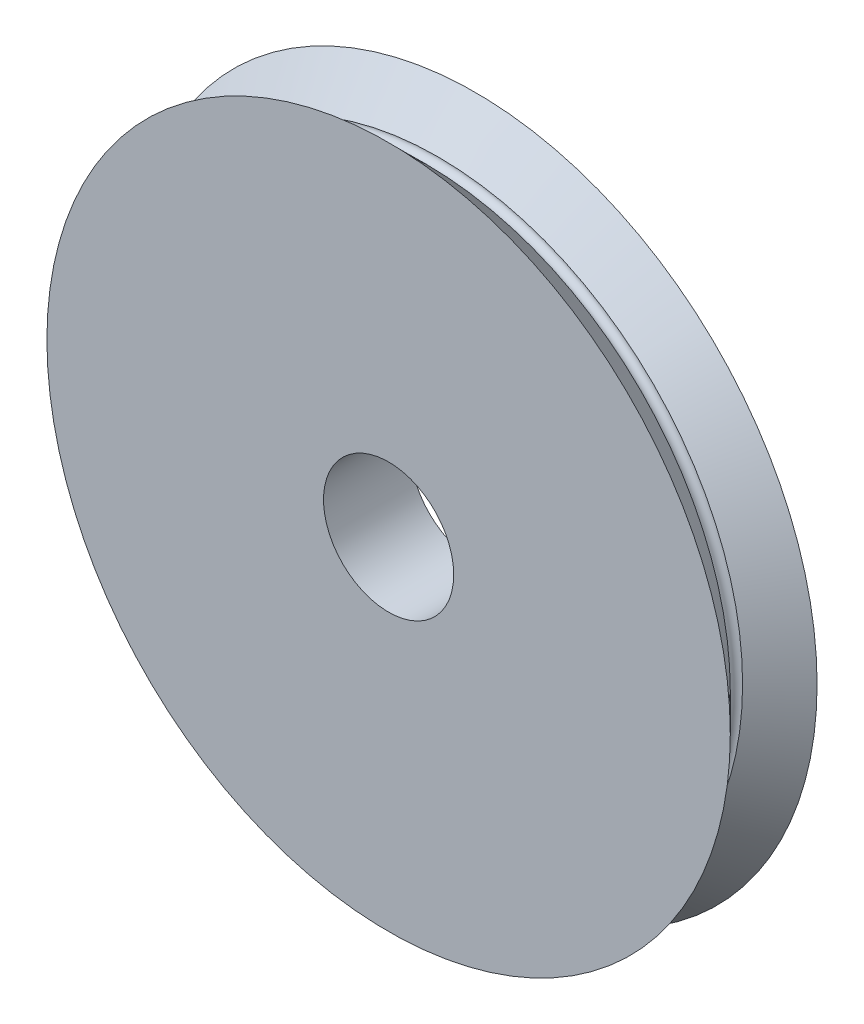
ISO-10303-21;
HEADER;
FILE_DESCRIPTION(('STEP AP214'),'2;1');
FILE_NAME('part.step','',(''),(''),'','','');
FILE_SCHEMA(('AUTOMOTIVE_DESIGN { 1 0 10303 214 1 1 1 1 }'));
ENDSEC;
DATA;
#1=APPLICATION_CONTEXT('core data for automotive mechanical design processes');
#2=APPLICATION_PROTOCOL_DEFINITION('international standard','automotive_design',2000,#1);
#3=PRODUCT_CONTEXT('',#1,'mechanical');
#4=PRODUCT('Part','Part','',(#3));
#5=PRODUCT_RELATED_PRODUCT_CATEGORY('part','',(#4));
#6=PRODUCT_DEFINITION_FORMATION('','',#4);
#7=PRODUCT_DEFINITION_CONTEXT('part definition',#1,'design');
#8=PRODUCT_DEFINITION('design','',#6,#7);
#9=PRODUCT_DEFINITION_SHAPE('','',#8);
#10=(LENGTH_UNIT() NAMED_UNIT(*) SI_UNIT(.MILLI.,.METRE.));
#11=(NAMED_UNIT(*) PLANE_ANGLE_UNIT() SI_UNIT($,.RADIAN.));
#12=(NAMED_UNIT(*) SI_UNIT($,.STERADIAN.) SOLID_ANGLE_UNIT());
#13=UNCERTAINTY_MEASURE_WITH_UNIT(LENGTH_MEASURE(1.E-05),#10,'distance_accuracy_value','');
#14=(GEOMETRIC_REPRESENTATION_CONTEXT(3) GLOBAL_UNCERTAINTY_ASSIGNED_CONTEXT((#13)) GLOBAL_UNIT_ASSIGNED_CONTEXT((#10,
#11,#12)) REPRESENTATION_CONTEXT('',''));
#15=CARTESIAN_POINT('',(0.,0.,0.));
#16=DIRECTION('',(0.,0.,1.));
#17=DIRECTION('',(1.,0.,0.));
#18=AXIS2_PLACEMENT_3D('',#15,#16,#17);
#19=CARTESIAN_POINT('',(50.,0.,0.));
#20=DIRECTION('',(0.,0.,1.));
#21=DIRECTION('',(1.,0.,0.));
#22=AXIS2_PLACEMENT_3D('',#19,#20,#21);
#23=PLANE('',#22);
#24=CARTESIAN_POINT('',(0.,0.,0.));
#25=DIRECTION('',(0.,0.,1.));
#26=DIRECTION('',(1.,0.,0.));
#27=AXIS2_PLACEMENT_3D('',#24,#25,#26);
#28=CIRCLE('',#27,50.);
#29=CARTESIAN_POINT('',(50.,0.,0.));
#30=VERTEX_POINT('',#29);
#31=EDGE_CURVE('E10',#30,#30,#28,.T.);
#32=ORIENTED_EDGE('',*,*,#31,.T.);
#33=EDGE_LOOP('',(#32));
#34=FACE_BOUND('',#33,.T.);
#35=CARTESIAN_POINT('',(0.,0.,0.));
#36=DIRECTION('',(0.,0.,1.));
#37=DIRECTION('',(1.,0.,0.));
#38=AXIS2_PLACEMENT_3D('',#35,#36,#37);
#39=CIRCLE('',#38,9.525);
#40=CARTESIAN_POINT('',(9.525,0.,0.));
#41=VERTEX_POINT('',#40);
#42=EDGE_CURVE('E52',#41,#41,#39,.T.);
#43=ORIENTED_EDGE('',*,*,#42,.F.);
#44=EDGE_LOOP('',(#43));
#45=FACE_BOUND('',#44,.T.);
#46=ADVANCED_FACE('F30',(#34,#45),#23,.T.);
#47=CARTESIAN_POINT('',(0.,0.,0.));
#48=DIRECTION('',(0.,0.,1.));
#49=DIRECTION('',(1.,0.,0.));
#50=AXIS2_PLACEMENT_3D('',#47,#48,#49);
#51=CONICAL_SURFACE('',#50,50.,0.785398163397453);
#52=CARTESIAN_POINT('',(0.,0.,-5.45000000000001));
#53=DIRECTION('',(0.,0.,1.));
#54=DIRECTION('',(1.,0.,0.));
#55=AXIS2_PLACEMENT_3D('',#52,#53,#54);
#56=CIRCLE('',#55,44.5499999999999);
#57=CARTESIAN_POINT('',(44.5499999999999,0.,-5.45000000000001));
#58=VERTEX_POINT('',#57);
#59=EDGE_CURVE('E36',#58,#58,#56,.T.);
#60=ORIENTED_EDGE('',*,*,#59,.T.);
#61=EDGE_LOOP('',(#60));
#62=FACE_BOUND('',#61,.T.);
#63=ORIENTED_EDGE('',*,*,#31,.F.);
#64=EDGE_LOOP('',(#63));
#65=FACE_BOUND('',#64,.T.);
#66=ADVANCED_FACE('F60',(#62,#65),#51,.T.);
#67=CARTESIAN_POINT('',(0.,0.,-6.35000000000001));
#68=DIRECTION('',(0.,0.,1.));
#69=DIRECTION('',(1.,0.,0.));
#70=AXIS2_PLACEMENT_3D('',#67,#68,#69);
#71=TOROIDAL_SURFACE('',#70,44.5499999999999,0.9);
#72=CARTESIAN_POINT('',(0.,0.,-7.25000000000001));
#73=DIRECTION('',(0.,0.,1.));
#74=DIRECTION('',(1.,0.,0.));
#75=AXIS2_PLACEMENT_3D('',#72,#73,#74);
#76=CIRCLE('',#75,44.5499999999999);
#77=CARTESIAN_POINT('',(44.5499999999999,0.,-7.25000000000001));
#78=VERTEX_POINT('',#77);
#79=EDGE_CURVE('E40',#78,#78,#76,.T.);
#80=ORIENTED_EDGE('',*,*,#79,.T.);
#81=EDGE_LOOP('',(#80));
#82=FACE_BOUND('',#81,.T.);
#83=ORIENTED_EDGE('',*,*,#59,.F.);
#84=EDGE_LOOP('',(#83));
#85=FACE_BOUND('',#84,.T.);
#86=ADVANCED_FACE('F64',(#82,#85),#71,.F.);
#87=CARTESIAN_POINT('',(0.,0.,-7.25000000000001));
#88=DIRECTION('',(0.,0.,-1.));
#89=DIRECTION('',(-1.,0.,0.));
#90=AXIS2_PLACEMENT_3D('',#87,#88,#89);
#91=CONICAL_SURFACE('',#90,44.5499999999999,0.785398163397453);
#92=CARTESIAN_POINT('',(0.,0.,-12.7));
#93=DIRECTION('',(0.,0.,1.));
#94=DIRECTION('',(1.,0.,0.));
#95=AXIS2_PLACEMENT_3D('',#92,#93,#94);
#96=CIRCLE('',#95,50.);
#97=CARTESIAN_POINT('',(50.,0.,-12.7));
#98=VERTEX_POINT('',#97);
#99=EDGE_CURVE('E44',#98,#98,#96,.T.);
#100=ORIENTED_EDGE('',*,*,#99,.T.);
#101=EDGE_LOOP('',(#100));
#102=FACE_BOUND('',#101,.T.);
#103=ORIENTED_EDGE('',*,*,#79,.F.);
#104=EDGE_LOOP('',(#103));
#105=FACE_BOUND('',#104,.T.);
#106=ADVANCED_FACE('F68',(#102,#105),#91,.T.);
#107=CARTESIAN_POINT('',(9.525,0.,-12.7));
#108=DIRECTION('',(0.,0.,-1.));
#109=DIRECTION('',(-1.,0.,0.));
#110=AXIS2_PLACEMENT_3D('',#107,#108,#109);
#111=PLANE('',#110);
#112=CARTESIAN_POINT('',(0.,0.,-12.7));
#113=DIRECTION('',(0.,0.,1.));
#114=DIRECTION('',(1.,0.,0.));
#115=AXIS2_PLACEMENT_3D('',#112,#113,#114);
#116=CIRCLE('',#115,9.525);
#117=CARTESIAN_POINT('',(9.525,0.,-12.7));
#118=VERTEX_POINT('',#117);
#119=EDGE_CURVE('E49',#118,#118,#116,.T.);
#120=ORIENTED_EDGE('',*,*,#119,.T.);
#121=EDGE_LOOP('',(#120));
#122=FACE_BOUND('',#121,.T.);
#123=ORIENTED_EDGE('',*,*,#99,.F.);
#124=EDGE_LOOP('',(#123));
#125=FACE_BOUND('',#124,.T.);
#126=ADVANCED_FACE('F75',(#122,#125),#111,.T.);
#127=CARTESIAN_POINT('',(0.,0.,0.));
#128=DIRECTION('',(0.,0.,1.));
#129=DIRECTION('',(1.,0.,0.));
#130=AXIS2_PLACEMENT_3D('',#127,#128,#129);
#131=CYLINDRICAL_SURFACE('',#130,9.525);
#132=ORIENTED_EDGE('',*,*,#42,.T.);
#133=EDGE_LOOP('',(#132));
#134=FACE_BOUND('',#133,.T.);
#135=ORIENTED_EDGE('',*,*,#119,.F.);
#136=EDGE_LOOP('',(#135));
#137=FACE_BOUND('',#136,.T.);
#138=ADVANCED_FACE('F56',(#134,#137),#131,.F.);
#139=CLOSED_SHELL('',(#46,#66,#86,#106,#126,#138));
#140=MANIFOLD_SOLID_BREP('B2',#139);
#141=ADVANCED_BREP_SHAPE_REPRESENTATION('',(#18,#140),#14);
#142=SHAPE_DEFINITION_REPRESENTATION(#9,#141);
ENDSEC;
END-ISO-10303-21;
